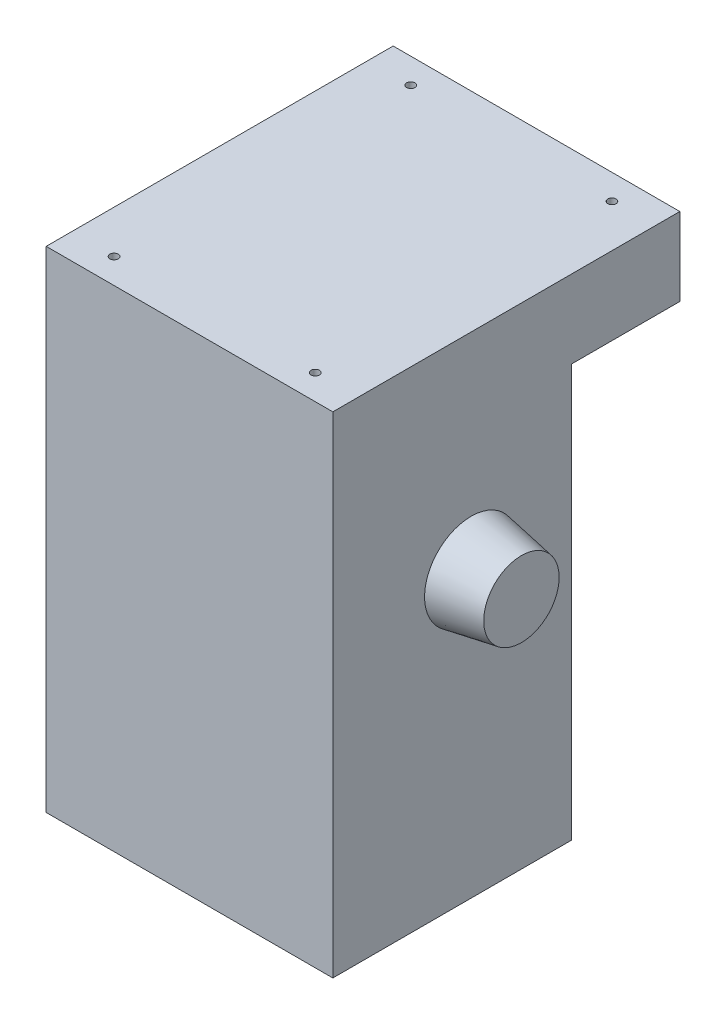
ISO-10303-21;
HEADER;
FILE_DESCRIPTION(('STEP AP214'),'2;1');
FILE_NAME('part.step','',(''),(''),'','','');
FILE_SCHEMA(('AUTOMOTIVE_DESIGN { 1 0 10303 214 1 1 1 1 }'));
ENDSEC;
DATA;
#1=APPLICATION_CONTEXT('core data for automotive mechanical design processes');
#2=APPLICATION_PROTOCOL_DEFINITION('international standard','automotive_design',2000,#1);
#3=PRODUCT_CONTEXT('',#1,'mechanical');
#4=PRODUCT('Part','Part','',(#3));
#5=PRODUCT_RELATED_PRODUCT_CATEGORY('part','',(#4));
#6=PRODUCT_DEFINITION_FORMATION('','',#4);
#7=PRODUCT_DEFINITION_CONTEXT('part definition',#1,'design');
#8=PRODUCT_DEFINITION('design','',#6,#7);
#9=PRODUCT_DEFINITION_SHAPE('','',#8);
#10=(LENGTH_UNIT() NAMED_UNIT(*) SI_UNIT(.MILLI.,.METRE.));
#11=(NAMED_UNIT(*) PLANE_ANGLE_UNIT() SI_UNIT($,.RADIAN.));
#12=(NAMED_UNIT(*) SI_UNIT($,.STERADIAN.) SOLID_ANGLE_UNIT());
#13=UNCERTAINTY_MEASURE_WITH_UNIT(LENGTH_MEASURE(1.E-05),#10,'distance_accuracy_value','');
#14=(GEOMETRIC_REPRESENTATION_CONTEXT(3) GLOBAL_UNCERTAINTY_ASSIGNED_CONTEXT((#13)) GLOBAL_UNIT_ASSIGNED_CONTEXT((#10,
#11,#12)) REPRESENTATION_CONTEXT('',''));
#15=CARTESIAN_POINT('',(0.,0.,0.));
#16=DIRECTION('',(0.,0.,1.));
#17=DIRECTION('',(1.,0.,0.));
#18=AXIS2_PLACEMENT_3D('',#15,#16,#17);
#19=CARTESIAN_POINT('',(40.,195.,-80.5));
#20=DIRECTION('',(0.,1.,0.));
#21=DIRECTION('',(0.,0.,1.));
#22=AXIS2_PLACEMENT_3D('',#19,#20,#21);
#23=CYLINDRICAL_SURFACE('',#22,1.65);
#24=CARTESIAN_POINT('',(40.,187.,-80.5));
#25=DIRECTION('',(0.,1.,0.));
#26=DIRECTION('',(0.,0.,1.));
#27=AXIS2_PLACEMENT_3D('',#24,#25,#26);
#28=CIRCLE('',#27,1.65);
#29=CARTESIAN_POINT('',(40.,187.,-78.85));
#30=VERTEX_POINT('',#29);
#31=EDGE_CURVE('E174',#30,#30,#28,.T.);
#32=ORIENTED_EDGE('',*,*,#31,.F.);
#33=EDGE_LOOP('',(#32));
#34=FACE_BOUND('',#33,.T.);
#35=CARTESIAN_POINT('',(40.,195.,-80.5));
#36=DIRECTION('',(0.,1.,0.));
#37=DIRECTION('',(0.,0.,1.));
#38=AXIS2_PLACEMENT_3D('',#35,#36,#37);
#39=CIRCLE('',#38,1.64999999999999);
#40=CARTESIAN_POINT('',(40.,195.,-78.85));
#41=VERTEX_POINT('',#40);
#42=EDGE_CURVE('E171',#41,#41,#39,.T.);
#43=ORIENTED_EDGE('',*,*,#42,.T.);
#44=EDGE_LOOP('',(#43));
#45=FACE_BOUND('',#44,.T.);
#46=ADVANCED_FACE('F38',(#34,#45),#23,.F.);
#47=CARTESIAN_POINT('',(40.,187.,-80.5));
#48=DIRECTION('',(0.,1.,0.));
#49=DIRECTION('',(0.,0.,1.));
#50=AXIS2_PLACEMENT_3D('',#47,#48,#49);
#51=CONICAL_SURFACE('',#50,1.65,1.02974425867666);
#52=CARTESIAN_POINT('',(40.,186.008579978605,-80.5));
#53=VERTEX_POINT('',#52);
#54=VERTEX_LOOP('',#53);
#55=FACE_BOUND('',#54,.T.);
#56=ORIENTED_EDGE('',*,*,#31,.T.);
#57=EDGE_LOOP('',(#56));
#58=FACE_BOUND('',#57,.T.);
#59=ADVANCED_FACE('F223',(#55,#58),#51,.F.);
#60=CARTESIAN_POINT('',(40.,195.,37.5));
#61=DIRECTION('',(0.,1.,0.));
#62=DIRECTION('',(0.,0.,1.));
#63=AXIS2_PLACEMENT_3D('',#60,#61,#62);
#64=CYLINDRICAL_SURFACE('',#63,1.65);
#65=CARTESIAN_POINT('',(40.,187.,37.5));
#66=DIRECTION('',(0.,1.,0.));
#67=DIRECTION('',(0.,0.,1.));
#68=AXIS2_PLACEMENT_3D('',#65,#66,#67);
#69=CIRCLE('',#68,1.65);
#70=CARTESIAN_POINT('',(40.,187.,39.15));
#71=VERTEX_POINT('',#70);
#72=EDGE_CURVE('E168',#71,#71,#69,.T.);
#73=ORIENTED_EDGE('',*,*,#72,.F.);
#74=EDGE_LOOP('',(#73));
#75=FACE_BOUND('',#74,.T.);
#76=CARTESIAN_POINT('',(40.,195.,37.5));
#77=DIRECTION('',(0.,1.,0.));
#78=DIRECTION('',(0.,0.,1.));
#79=AXIS2_PLACEMENT_3D('',#76,#77,#78);
#80=CIRCLE('',#79,1.64999999999999);
#81=CARTESIAN_POINT('',(40.,195.,39.15));
#82=VERTEX_POINT('',#81);
#83=EDGE_CURVE('E165',#82,#82,#80,.T.);
#84=ORIENTED_EDGE('',*,*,#83,.T.);
#85=EDGE_LOOP('',(#84));
#86=FACE_BOUND('',#85,.T.);
#87=ADVANCED_FACE('F228',(#75,#86),#64,.F.);
#88=CARTESIAN_POINT('',(40.,187.,37.5));
#89=DIRECTION('',(0.,1.,0.));
#90=DIRECTION('',(0.,0.,1.));
#91=AXIS2_PLACEMENT_3D('',#88,#89,#90);
#92=CONICAL_SURFACE('',#91,1.65,1.02974425867666);
#93=CARTESIAN_POINT('',(40.,186.008579978605,37.5));
#94=VERTEX_POINT('',#93);
#95=VERTEX_LOOP('',#94);
#96=FACE_BOUND('',#95,.T.);
#97=ORIENTED_EDGE('',*,*,#72,.T.);
#98=EDGE_LOOP('',(#97));
#99=FACE_BOUND('',#98,.T.);
#100=ADVANCED_FACE('F184',(#96,#99),#92,.F.);
#101=CARTESIAN_POINT('',(57.,164.,-47.5));
#102=DIRECTION('',(-1.,0.,0.));
#103=DIRECTION('',(0.,0.,1.));
#104=AXIS2_PLACEMENT_3D('',#101,#102,#103);
#105=PLANE('',#104);
#106=CARTESIAN_POINT('',(57.,113.,-7.49999999999999));
#107=DIRECTION('',(-1.,0.,0.));
#108=DIRECTION('',(0.,0.,1.));
#109=AXIS2_PLACEMENT_3D('',#106,#107,#108);
#110=CIRCLE('',#109,18.5265396141693);
#111=CARTESIAN_POINT('',(57.,113.,11.0265396141693));
#112=VERTEX_POINT('',#111);
#113=EDGE_CURVE('E46',#112,#112,#110,.F.);
#114=ORIENTED_EDGE('',*,*,#113,.F.);
#115=EDGE_LOOP('',(#114));
#116=FACE_BOUND('',#115,.T.);
#117=DIRECTION('',(0.,0.,-1.));
#118=VECTOR('',#117,1.);
#119=CARTESIAN_POINT('',(57.,0.,-47.5));
#120=LINE('',#119,#118);
#121=CARTESIAN_POINT('',(57.,0.,47.5));
#122=VERTEX_POINT('',#121);
#123=CARTESIAN_POINT('',(57.,0.,-47.5));
#124=VERTEX_POINT('',#123);
#125=EDGE_CURVE('E141',#122,#124,#120,.T.);
#126=ORIENTED_EDGE('',*,*,#125,.T.);
#127=DIRECTION('',(0.,-1.,0.));
#128=VECTOR('',#127,1.);
#129=CARTESIAN_POINT('',(57.,164.,-47.5));
#130=LINE('',#129,#128);
#131=CARTESIAN_POINT('',(57.,164.,-47.5));
#132=VERTEX_POINT('',#131);
#133=EDGE_CURVE('E162',#132,#124,#130,.T.);
#134=ORIENTED_EDGE('',*,*,#133,.F.);
#135=DIRECTION('',(0.,0.,-1.));
#136=VECTOR('',#135,1.);
#137=CARTESIAN_POINT('',(57.,164.,47.5));
#138=LINE('',#137,#136);
#139=CARTESIAN_POINT('',(57.,164.,-90.5));
#140=VERTEX_POINT('',#139);
#141=EDGE_CURVE('E133',#132,#140,#138,.T.);
#142=ORIENTED_EDGE('',*,*,#141,.T.);
#143=DIRECTION('',(0.,-1.,0.));
#144=VECTOR('',#143,1.);
#145=CARTESIAN_POINT('',(57.,195.,-90.5));
#146=LINE('',#145,#144);
#147=CARTESIAN_POINT('',(57.,195.,-90.5));
#148=VERTEX_POINT('',#147);
#149=EDGE_CURVE('E138',#148,#140,#146,.T.);
#150=ORIENTED_EDGE('',*,*,#149,.F.);
#151=DIRECTION('',(0.,0.,-1.));
#152=VECTOR('',#151,1.);
#153=CARTESIAN_POINT('',(57.,195.,47.5));
#154=LINE('',#153,#152);
#155=CARTESIAN_POINT('',(57.,195.,47.5));
#156=VERTEX_POINT('',#155);
#157=EDGE_CURVE('E126',#156,#148,#154,.T.);
#158=ORIENTED_EDGE('',*,*,#157,.F.);
#159=DIRECTION('',(0.,-1.,0.));
#160=VECTOR('',#159,1.);
#161=CARTESIAN_POINT('',(57.,164.,47.5));
#162=LINE('',#161,#160);
#163=EDGE_CURVE('E145',#156,#122,#162,.T.);
#164=ORIENTED_EDGE('',*,*,#163,.T.);
#165=EDGE_LOOP('',(#126,#134,#142,#150,#158,#164));
#166=FACE_BOUND('',#165,.T.);
#167=ADVANCED_FACE('F180',(#116,#166),#105,.F.);
#168=CARTESIAN_POINT('',(-57.,164.,-47.5));
#169=DIRECTION('',(0.,0.,1.));
#170=DIRECTION('',(1.,0.,0.));
#171=AXIS2_PLACEMENT_3D('',#168,#169,#170);
#172=PLANE('',#171);
#173=DIRECTION('',(-1.,0.,0.));
#174=VECTOR('',#173,1.);
#175=CARTESIAN_POINT('',(-57.,0.,-47.5));
#176=LINE('',#175,#174);
#177=CARTESIAN_POINT('',(-57.,0.,-47.5));
#178=VERTEX_POINT('',#177);
#179=EDGE_CURVE('E149',#124,#178,#176,.T.);
#180=ORIENTED_EDGE('',*,*,#179,.T.);
#181=DIRECTION('',(0.,-1.,0.));
#182=VECTOR('',#181,1.);
#183=CARTESIAN_POINT('',(-57.,164.,-47.5));
#184=LINE('',#183,#182);
#185=CARTESIAN_POINT('',(-57.,164.,-47.5));
#186=VERTEX_POINT('',#185);
#187=EDGE_CURVE('E159',#186,#178,#184,.T.);
#188=ORIENTED_EDGE('',*,*,#187,.F.);
#189=DIRECTION('',(-1.,0.,0.));
#190=VECTOR('',#189,1.);
#191=CARTESIAN_POINT('',(-57.,164.,-47.5));
#192=LINE('',#191,#190);
#193=EDGE_CURVE('E142',#132,#186,#192,.T.);
#194=ORIENTED_EDGE('',*,*,#193,.F.);
#195=ORIENTED_EDGE('',*,*,#133,.T.);
#196=EDGE_LOOP('',(#180,#188,#194,#195));
#197=FACE_BOUND('',#196,.T.);
#198=ADVANCED_FACE('F183',(#197),#172,.F.);
#199=CARTESIAN_POINT('',(-57.,164.,-47.5));
#200=DIRECTION('',(1.,0.,0.));
#201=DIRECTION('',(0.,0.,-1.));
#202=AXIS2_PLACEMENT_3D('',#199,#200,#201);
#203=PLANE('',#202);
#204=CARTESIAN_POINT('',(-57.,113.,-7.50000000000001));
#205=DIRECTION('',(1.,0.,0.));
#206=DIRECTION('',(0.,0.,-1.));
#207=AXIS2_PLACEMENT_3D('',#204,#205,#206);
#208=CIRCLE('',#207,18.5265396141693);
#209=CARTESIAN_POINT('',(-57.,113.,-26.0265396141693));
#210=VERTEX_POINT('',#209);
#211=EDGE_CURVE('E11',#210,#210,#208,.F.);
#212=ORIENTED_EDGE('',*,*,#211,.F.);
#213=EDGE_LOOP('',(#212));
#214=FACE_BOUND('',#213,.T.);
#215=DIRECTION('',(0.,0.,1.));
#216=VECTOR('',#215,1.);
#217=CARTESIAN_POINT('',(-57.,0.,-47.5));
#218=LINE('',#217,#216);
#219=CARTESIAN_POINT('',(-57.,0.,47.5));
#220=VERTEX_POINT('',#219);
#221=EDGE_CURVE('E151',#178,#220,#218,.T.);
#222=ORIENTED_EDGE('',*,*,#221,.T.);
#223=DIRECTION('',(0.,-1.,0.));
#224=VECTOR('',#223,1.);
#225=CARTESIAN_POINT('',(-57.,164.,47.5));
#226=LINE('',#225,#224);
#227=CARTESIAN_POINT('',(-57.,195.,47.5));
#228=VERTEX_POINT('',#227);
#229=EDGE_CURVE('E156',#228,#220,#226,.T.);
#230=ORIENTED_EDGE('',*,*,#229,.F.);
#231=DIRECTION('',(0.,0.,1.));
#232=VECTOR('',#231,1.);
#233=CARTESIAN_POINT('',(-57.,195.,47.5));
#234=LINE('',#233,#232);
#235=CARTESIAN_POINT('',(-57.,195.,-90.5));
#236=VERTEX_POINT('',#235);
#237=EDGE_CURVE('E119',#236,#228,#234,.T.);
#238=ORIENTED_EDGE('',*,*,#237,.F.);
#239=DIRECTION('',(0.,-1.,0.));
#240=VECTOR('',#239,1.);
#241=CARTESIAN_POINT('',(-57.,195.,-90.5));
#242=LINE('',#241,#240);
#243=CARTESIAN_POINT('',(-57.,164.,-90.5));
#244=VERTEX_POINT('',#243);
#245=EDGE_CURVE('E130',#236,#244,#242,.T.);
#246=ORIENTED_EDGE('',*,*,#245,.T.);
#247=DIRECTION('',(0.,0.,1.));
#248=VECTOR('',#247,1.);
#249=CARTESIAN_POINT('',(-57.,164.,47.5));
#250=LINE('',#249,#248);
#251=EDGE_CURVE('E118',#244,#186,#250,.T.);
#252=ORIENTED_EDGE('',*,*,#251,.T.);
#253=ORIENTED_EDGE('',*,*,#187,.T.);
#254=EDGE_LOOP('',(#222,#230,#238,#246,#252,#253));
#255=FACE_BOUND('',#254,.T.);
#256=ADVANCED_FACE('F200',(#214,#255),#203,.F.);
#257=CARTESIAN_POINT('',(-57.,164.,47.5));
#258=DIRECTION('',(0.,0.,-1.));
#259=DIRECTION('',(-1.,0.,0.));
#260=AXIS2_PLACEMENT_3D('',#257,#258,#259);
#261=PLANE('',#260);
#262=DIRECTION('',(1.,0.,0.));
#263=VECTOR('',#262,1.);
#264=CARTESIAN_POINT('',(-57.,0.,47.5));
#265=LINE('',#264,#263);
#266=EDGE_CURVE('E146',#220,#122,#265,.T.);
#267=ORIENTED_EDGE('',*,*,#266,.T.);
#268=ORIENTED_EDGE('',*,*,#163,.F.);
#269=DIRECTION('',(1.,0.,0.));
#270=VECTOR('',#269,1.);
#271=CARTESIAN_POINT('',(-57.,195.,47.5));
#272=LINE('',#271,#270);
#273=EDGE_CURVE('E122',#228,#156,#272,.T.);
#274=ORIENTED_EDGE('',*,*,#273,.F.);
#275=ORIENTED_EDGE('',*,*,#229,.T.);
#276=EDGE_LOOP('',(#267,#268,#274,#275));
#277=FACE_BOUND('',#276,.T.);
#278=ADVANCED_FACE('F212',(#277),#261,.F.);
#279=CARTESIAN_POINT('',(0.,0.,0.));
#280=DIRECTION('',(0.,1.,0.));
#281=DIRECTION('',(0.,0.,1.));
#282=AXIS2_PLACEMENT_3D('',#279,#280,#281);
#283=PLANE('',#282);
#284=ORIENTED_EDGE('',*,*,#125,.F.);
#285=ORIENTED_EDGE('',*,*,#266,.F.);
#286=ORIENTED_EDGE('',*,*,#221,.F.);
#287=ORIENTED_EDGE('',*,*,#179,.F.);
#288=EDGE_LOOP('',(#284,#285,#286,#287));
#289=FACE_BOUND('',#288,.T.);
#290=ADVANCED_FACE('F192',(#289),#283,.F.);
#291=CARTESIAN_POINT('',(-57.,195.,-90.5));
#292=DIRECTION('',(0.,0.,1.));
#293=DIRECTION('',(1.,0.,0.));
#294=AXIS2_PLACEMENT_3D('',#291,#292,#293);
#295=PLANE('',#294);
#296=DIRECTION('',(-1.,0.,0.));
#297=VECTOR('',#296,1.);
#298=CARTESIAN_POINT('',(-57.,164.,-90.5));
#299=LINE('',#298,#297);
#300=EDGE_CURVE('E123',#140,#244,#299,.T.);
#301=ORIENTED_EDGE('',*,*,#300,.T.);
#302=ORIENTED_EDGE('',*,*,#245,.F.);
#303=DIRECTION('',(-1.,0.,0.));
#304=VECTOR('',#303,1.);
#305=CARTESIAN_POINT('',(-57.,195.,-90.5));
#306=LINE('',#305,#304);
#307=EDGE_CURVE('E128',#148,#236,#306,.T.);
#308=ORIENTED_EDGE('',*,*,#307,.F.);
#309=ORIENTED_EDGE('',*,*,#149,.T.);
#310=EDGE_LOOP('',(#301,#302,#308,#309));
#311=FACE_BOUND('',#310,.T.);
#312=ADVANCED_FACE('F205',(#311),#295,.F.);
#313=CARTESIAN_POINT('',(0.,195.,0.));
#314=DIRECTION('',(0.,-1.,0.));
#315=DIRECTION('',(0.,0.,-1.));
#316=AXIS2_PLACEMENT_3D('',#313,#314,#315);
#317=PLANE('',#316);
#318=CARTESIAN_POINT('',(-40.,195.,-80.5));
#319=DIRECTION('',(0.,1.,0.));
#320=DIRECTION('',(0.,0.,1.));
#321=AXIS2_PLACEMENT_3D('',#318,#319,#320);
#322=CIRCLE('',#321,1.64999999999999);
#323=CARTESIAN_POINT('',(-40.,195.,-78.85));
#324=VERTEX_POINT('',#323);
#325=EDGE_CURVE('E106',#324,#324,#322,.T.);
#326=ORIENTED_EDGE('',*,*,#325,.F.);
#327=EDGE_LOOP('',(#326));
#328=FACE_BOUND('',#327,.T.);
#329=CARTESIAN_POINT('',(-40.,195.,37.5));
#330=DIRECTION('',(0.,1.,0.));
#331=DIRECTION('',(0.,0.,1.));
#332=AXIS2_PLACEMENT_3D('',#329,#330,#331);
#333=CIRCLE('',#332,1.64999999999999);
#334=CARTESIAN_POINT('',(-40.,195.,39.15));
#335=VERTEX_POINT('',#334);
#336=EDGE_CURVE('E105',#335,#335,#333,.T.);
#337=ORIENTED_EDGE('',*,*,#336,.F.);
#338=EDGE_LOOP('',(#337));
#339=FACE_BOUND('',#338,.T.);
#340=ORIENTED_EDGE('',*,*,#237,.T.);
#341=ORIENTED_EDGE('',*,*,#273,.T.);
#342=ORIENTED_EDGE('',*,*,#157,.T.);
#343=ORIENTED_EDGE('',*,*,#307,.T.);
#344=EDGE_LOOP('',(#340,#341,#342,#343));
#345=FACE_BOUND('',#344,.T.);
#346=ORIENTED_EDGE('',*,*,#83,.F.);
#347=EDGE_LOOP('',(#346));
#348=FACE_BOUND('',#347,.T.);
#349=ORIENTED_EDGE('',*,*,#42,.F.);
#350=EDGE_LOOP('',(#349));
#351=FACE_BOUND('',#350,.T.);
#352=ADVANCED_FACE('F208',(#328,#339,#345,#348,#351),#317,.F.);
#353=CARTESIAN_POINT('',(0.,164.,0.));
#354=DIRECTION('',(0.,-1.,0.));
#355=DIRECTION('',(0.,0.,-1.));
#356=AXIS2_PLACEMENT_3D('',#353,#354,#355);
#357=PLANE('',#356);
#358=ORIENTED_EDGE('',*,*,#141,.F.);
#359=ORIENTED_EDGE('',*,*,#193,.T.);
#360=ORIENTED_EDGE('',*,*,#251,.F.);
#361=ORIENTED_EDGE('',*,*,#300,.F.);
#362=EDGE_LOOP('',(#358,#359,#360,#361));
#363=FACE_BOUND('',#362,.T.);
#364=ADVANCED_FACE('F197',(#363),#357,.T.);
#365=CARTESIAN_POINT('',(-40.,187.,37.5));
#366=DIRECTION('',(0.,1.,0.));
#367=DIRECTION('',(0.,0.,1.));
#368=AXIS2_PLACEMENT_3D('',#365,#366,#367);
#369=CONICAL_SURFACE('',#368,1.65,1.02974425867666);
#370=CARTESIAN_POINT('',(-40.,186.008579978605,37.5));
#371=VERTEX_POINT('',#370);
#372=VERTEX_LOOP('',#371);
#373=FACE_BOUND('',#372,.T.);
#374=CARTESIAN_POINT('',(-40.,187.,37.5));
#375=DIRECTION('',(0.,1.,0.));
#376=DIRECTION('',(0.,0.,1.));
#377=AXIS2_PLACEMENT_3D('',#374,#375,#376);
#378=CIRCLE('',#377,1.65);
#379=CARTESIAN_POINT('',(-40.,187.,39.15));
#380=VERTEX_POINT('',#379);
#381=EDGE_CURVE('E109',#380,#380,#378,.T.);
#382=ORIENTED_EDGE('',*,*,#381,.T.);
#383=EDGE_LOOP('',(#382));
#384=FACE_BOUND('',#383,.T.);
#385=ADVANCED_FACE('F288',(#373,#384),#369,.F.);
#386=CARTESIAN_POINT('',(-40.,195.,37.5));
#387=DIRECTION('',(0.,1.,0.));
#388=DIRECTION('',(0.,0.,1.));
#389=AXIS2_PLACEMENT_3D('',#386,#387,#388);
#390=CYLINDRICAL_SURFACE('',#389,1.65);
#391=ORIENTED_EDGE('',*,*,#381,.F.);
#392=EDGE_LOOP('',(#391));
#393=FACE_BOUND('',#392,.T.);
#394=ORIENTED_EDGE('',*,*,#336,.T.);
#395=EDGE_LOOP('',(#394));
#396=FACE_BOUND('',#395,.T.);
#397=ADVANCED_FACE('F99',(#393,#396),#390,.F.);
#398=CARTESIAN_POINT('',(-40.,187.,-80.5));
#399=DIRECTION('',(0.,1.,0.));
#400=DIRECTION('',(0.,0.,1.));
#401=AXIS2_PLACEMENT_3D('',#398,#399,#400);
#402=CONICAL_SURFACE('',#401,1.65,1.02974425867666);
#403=CARTESIAN_POINT('',(-40.,186.008579978605,-80.5));
#404=VERTEX_POINT('',#403);
#405=VERTEX_LOOP('',#404);
#406=FACE_BOUND('',#405,.T.);
#407=CARTESIAN_POINT('',(-40.,187.,-80.5));
#408=DIRECTION('',(0.,1.,0.));
#409=DIRECTION('',(0.,0.,1.));
#410=AXIS2_PLACEMENT_3D('',#407,#408,#409);
#411=CIRCLE('',#410,1.65);
#412=CARTESIAN_POINT('',(-40.,187.,-78.85));
#413=VERTEX_POINT('',#412);
#414=EDGE_CURVE('E103',#413,#413,#411,.T.);
#415=ORIENTED_EDGE('',*,*,#414,.T.);
#416=EDGE_LOOP('',(#415));
#417=FACE_BOUND('',#416,.T.);
#418=ADVANCED_FACE('F95',(#406,#417),#402,.F.);
#419=CARTESIAN_POINT('',(-40.,195.,-80.5));
#420=DIRECTION('',(0.,1.,0.));
#421=DIRECTION('',(0.,0.,1.));
#422=AXIS2_PLACEMENT_3D('',#419,#420,#421);
#423=CYLINDRICAL_SURFACE('',#422,1.65);
#424=ORIENTED_EDGE('',*,*,#414,.F.);
#425=EDGE_LOOP('',(#424));
#426=FACE_BOUND('',#425,.T.);
#427=ORIENTED_EDGE('',*,*,#325,.T.);
#428=EDGE_LOOP('',(#427));
#429=FACE_BOUND('',#428,.T.);
#430=ADVANCED_FACE('F98',(#426,#429),#423,.F.);
#431=CARTESIAN_POINT('',(77.,113.,-7.5));
#432=DIRECTION('',(-1.,0.,0.));
#433=DIRECTION('',(0.,0.,-1.));
#434=AXIS2_PLACEMENT_3D('',#431,#432,#433);
#435=CONICAL_SURFACE('',#434,15.,0.174532925199433);
#436=CARTESIAN_POINT('',(77.,113.,-7.5));
#437=DIRECTION('',(1.,0.,0.));
#438=DIRECTION('',(0.,0.,-1.));
#439=AXIS2_PLACEMENT_3D('',#436,#437,#438);
#440=CIRCLE('',#439,15.);
#441=CARTESIAN_POINT('',(77.,113.,-22.5));
#442=VERTEX_POINT('',#441);
#443=EDGE_CURVE('E112',#442,#442,#440,.T.);
#444=ORIENTED_EDGE('',*,*,#443,.F.);
#445=EDGE_LOOP('',(#444));
#446=FACE_BOUND('',#445,.T.);
#447=ORIENTED_EDGE('',*,*,#113,.T.);
#448=EDGE_LOOP('',(#447));
#449=FACE_BOUND('',#448,.T.);
#450=ADVANCED_FACE('F40',(#446,#449),#435,.T.);
#451=CARTESIAN_POINT('',(77.,113.,-7.5));
#452=DIRECTION('',(1.,0.,0.));
#453=DIRECTION('',(0.,0.,-1.));
#454=AXIS2_PLACEMENT_3D('',#451,#452,#453);
#455=PLANE('',#454);
#456=ORIENTED_EDGE('',*,*,#443,.T.);
#457=EDGE_LOOP('',(#456));
#458=FACE_BOUND('',#457,.T.);
#459=ADVANCED_FACE('F256',(#458),#455,.T.);
#460=CARTESIAN_POINT('',(-77.,113.,-7.5));
#461=DIRECTION('',(1.,0.,0.));
#462=DIRECTION('',(0.,0.,-1.));
#463=AXIS2_PLACEMENT_3D('',#460,#461,#462);
#464=CONICAL_SURFACE('',#463,15.,0.174532925199433);
#465=CARTESIAN_POINT('',(-77.,113.,-7.5));
#466=DIRECTION('',(1.,0.,0.));
#467=DIRECTION('',(0.,0.,-1.));
#468=AXIS2_PLACEMENT_3D('',#465,#466,#467);
#469=CIRCLE('',#468,15.);
#470=CARTESIAN_POINT('',(-77.,113.,-22.5));
#471=VERTEX_POINT('',#470);
#472=EDGE_CURVE('E413',#471,#471,#469,.T.);
#473=ORIENTED_EDGE('',*,*,#472,.T.);
#474=EDGE_LOOP('',(#473));
#475=FACE_BOUND('',#474,.T.);
#476=ORIENTED_EDGE('',*,*,#211,.T.);
#477=EDGE_LOOP('',(#476));
#478=FACE_BOUND('',#477,.T.);
#479=ADVANCED_FACE('F260',(#475,#478),#464,.T.);
#480=CARTESIAN_POINT('',(-77.,113.,-7.5));
#481=DIRECTION('',(-1.,0.,0.));
#482=DIRECTION('',(0.,0.,-1.));
#483=AXIS2_PLACEMENT_3D('',#480,#481,#482);
#484=PLANE('',#483);
#485=ORIENTED_EDGE('',*,*,#472,.F.);
#486=EDGE_LOOP('',(#485));
#487=FACE_BOUND('',#486,.T.);
#488=ADVANCED_FACE('F265',(#487),#484,.T.);
#489=CLOSED_SHELL('',(#46,#59,#87,#100,#167,#198,#256,#278,#290,#312,#352,#364,#385,#397,#418,
#430,#450,#459,#479,#488));
#490=MANIFOLD_SOLID_BREP('B2',#489);
#491=ADVANCED_BREP_SHAPE_REPRESENTATION('',(#18,#490),#14);
#492=SHAPE_DEFINITION_REPRESENTATION(#9,#491);
ENDSEC;
END-ISO-10303-21;
